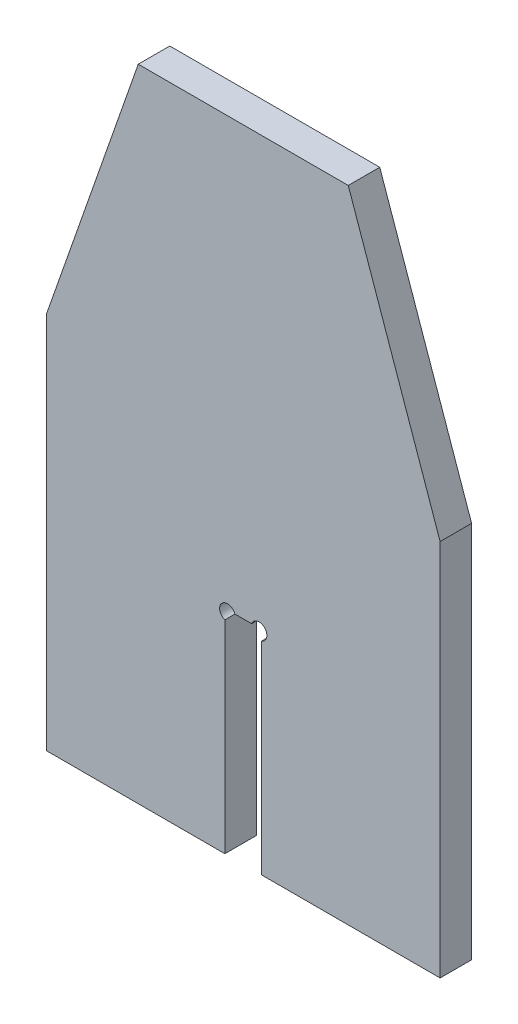
ISO-10303-21;
HEADER;
FILE_DESCRIPTION(('STEP AP214'),'2;1');
FILE_NAME('part.step','',(''),(''),'','','');
FILE_SCHEMA(('AUTOMOTIVE_DESIGN { 1 0 10303 214 1 1 1 1 }'));
ENDSEC;
DATA;
#1=APPLICATION_CONTEXT('core data for automotive mechanical design processes');
#2=APPLICATION_PROTOCOL_DEFINITION('international standard','automotive_design',2000,#1);
#3=PRODUCT_CONTEXT('',#1,'mechanical');
#4=PRODUCT('Part','Part','',(#3));
#5=PRODUCT_RELATED_PRODUCT_CATEGORY('part','',(#4));
#6=PRODUCT_DEFINITION_FORMATION('','',#4);
#7=PRODUCT_DEFINITION_CONTEXT('part definition',#1,'design');
#8=PRODUCT_DEFINITION('design','',#6,#7);
#9=PRODUCT_DEFINITION_SHAPE('','',#8);
#10=(LENGTH_UNIT() NAMED_UNIT(*) SI_UNIT(.MILLI.,.METRE.));
#11=(NAMED_UNIT(*) PLANE_ANGLE_UNIT() SI_UNIT($,.RADIAN.));
#12=(NAMED_UNIT(*) SI_UNIT($,.STERADIAN.) SOLID_ANGLE_UNIT());
#13=UNCERTAINTY_MEASURE_WITH_UNIT(LENGTH_MEASURE(1.E-05),#10,'distance_accuracy_value','');
#14=(GEOMETRIC_REPRESENTATION_CONTEXT(3) GLOBAL_UNCERTAINTY_ASSIGNED_CONTEXT((#13)) GLOBAL_UNIT_ASSIGNED_CONTEXT((#10,
#11,#12)) REPRESENTATION_CONTEXT('',''));
#15=CARTESIAN_POINT('',(0.,0.,0.));
#16=DIRECTION('',(0.,0.,1.));
#17=DIRECTION('',(1.,0.,0.));
#18=AXIS2_PLACEMENT_3D('',#15,#16,#17);
#19=CARTESIAN_POINT('',(0.,0.,0.));
#20=DIRECTION('',(0.,0.,1.));
#21=DIRECTION('',(0.,-1.,0.));
#22=AXIS2_PLACEMENT_3D('',#19,#20,#21);
#23=PLANE('',#22);
#24=DIRECTION('',(1.,0.,0.));
#25=VECTOR('',#24,1.);
#26=CARTESIAN_POINT('',(-1.09287578986539E-13,252.000025877441,0.));
#27=LINE('',#26,#25);
#28=CARTESIAN_POINT('',(-17.5,252.000025877441,0.));
#29=VERTEX_POINT('',#28);
#30=CARTESIAN_POINT('',(14.1253730857898,252.000025877441,0.));
#31=VERTEX_POINT('',#30);
#32=EDGE_CURVE('E51',#29,#31,#27,.T.);
#33=ORIENTED_EDGE('',*,*,#32,.T.);
#34=DIRECTION('',(0.759824818478074,-0.650127868364956,0.));
#35=VECTOR('',#34,1.);
#36=CARTESIAN_POINT('',(130.454120158714,152.465819406573,0.));
#37=LINE('',#36,#35);
#38=CARTESIAN_POINT('',(37.4999999999995,232.000025877441,0.));
#39=VERTEX_POINT('',#38);
#40=EDGE_CURVE('E185',#31,#39,#37,.T.);
#41=ORIENTED_EDGE('',*,*,#40,.T.);
#42=DIRECTION('',(0.,-1.,0.));
#43=VECTOR('',#42,1.);
#44=CARTESIAN_POINT('',(37.4999999999996,0.,0.));
#45=LINE('',#44,#43);
#46=CARTESIAN_POINT('',(37.4999999999994,160.,0.));
#47=VERTEX_POINT('',#46);
#48=EDGE_CURVE('E255',#39,#47,#45,.T.);
#49=ORIENTED_EDGE('',*,*,#48,.T.);
#50=DIRECTION('',(-1.,0.,0.));
#51=VECTOR('',#50,1.);
#52=CARTESIAN_POINT('',(0.,160.,0.));
#53=LINE('',#52,#51);
#54=CARTESIAN_POINT('',(3.50000000001344,160.,0.));
#55=VERTEX_POINT('',#54);
#56=EDGE_CURVE('E244',#47,#55,#53,.T.);
#57=ORIENTED_EDGE('',*,*,#56,.T.);
#58=DIRECTION('',(0.,1.,0.));
#59=VECTOR('',#58,1.);
#60=CARTESIAN_POINT('',(3.50000000001346,0.,0.));
#61=LINE('',#60,#59);
#62=CARTESIAN_POINT('',(3.50000000001344,198.585786437627,0.));
#63=VERTEX_POINT('',#62);
#64=EDGE_CURVE('E216',#55,#63,#61,.T.);
#65=ORIENTED_EDGE('',*,*,#64,.T.);
#66=CARTESIAN_POINT('',(3.00000000001337,200.,0.));
#67=DIRECTION('',(0.,0.,-1.));
#68=DIRECTION('',(0.,1.,0.));
#69=AXIS2_PLACEMENT_3D('',#66,#67,#68);
#70=CIRCLE('',#69,1.49999999999998);
#71=CARTESIAN_POINT('',(1.5857864376403,200.5,0.));
#72=VERTEX_POINT('',#71);
#73=EDGE_CURVE('E243',#63,#72,#70,.F.);
#74=ORIENTED_EDGE('',*,*,#73,.T.);
#75=DIRECTION('',(-1.,0.,0.));
#76=VECTOR('',#75,1.);
#77=CARTESIAN_POINT('',(0.,200.5,0.));
#78=LINE('',#77,#76);
#79=CARTESIAN_POINT('',(-1.58578643761337,200.5,0.));
#80=VERTEX_POINT('',#79);
#81=EDGE_CURVE('E220',#72,#80,#78,.T.);
#82=ORIENTED_EDGE('',*,*,#81,.T.);
#83=CARTESIAN_POINT('',(-2.99999999998644,200.,0.));
#84=DIRECTION('',(0.,0.,-1.));
#85=DIRECTION('',(0.,1.,0.));
#86=AXIS2_PLACEMENT_3D('',#83,#84,#85);
#87=CIRCLE('',#86,1.49999999999998);
#88=CARTESIAN_POINT('',(-3.49999999998656,198.585786437627,0.));
#89=VERTEX_POINT('',#88);
#90=EDGE_CURVE('E232',#80,#89,#87,.F.);
#91=ORIENTED_EDGE('',*,*,#90,.T.);
#92=DIRECTION('',(0.,-1.,0.));
#93=VECTOR('',#92,1.);
#94=CARTESIAN_POINT('',(-3.49999999998656,0.,0.));
#95=LINE('',#94,#93);
#96=CARTESIAN_POINT('',(-3.49999999998656,160.,0.));
#97=VERTEX_POINT('',#96);
#98=EDGE_CURVE('E229',#89,#97,#95,.T.);
#99=ORIENTED_EDGE('',*,*,#98,.T.);
#100=DIRECTION('',(-1.,0.,0.));
#101=VECTOR('',#100,1.);
#102=CARTESIAN_POINT('',(-2.48065457064683E-13,160.,0.));
#103=LINE('',#102,#101);
#104=CARTESIAN_POINT('',(-37.4999999999997,160.,0.));
#105=VERTEX_POINT('',#104);
#106=EDGE_CURVE('E282',#97,#105,#103,.T.);
#107=ORIENTED_EDGE('',*,*,#106,.T.);
#108=DIRECTION('',(0.,-1.,0.));
#109=VECTOR('',#108,1.);
#110=CARTESIAN_POINT('',(-37.4999999999997,0.,0.));
#111=LINE('',#110,#109);
#112=CARTESIAN_POINT('',(-37.4999999999998,232.000025877442,0.));
#113=VERTEX_POINT('',#112);
#114=EDGE_CURVE('E270',#113,#105,#111,.T.);
#115=ORIENTED_EDGE('',*,*,#114,.F.);
#116=DIRECTION('',(0.707106781186542,0.707106781186553,0.));
#117=VECTOR('',#116,1.);
#118=CARTESIAN_POINT('',(-134.750012938719,134.750012938721,0.));
#119=LINE('',#118,#117);
#120=EDGE_CURVE('E149',#113,#29,#119,.T.);
#121=ORIENTED_EDGE('',*,*,#120,.T.);
#122=EDGE_LOOP('',(#33,#41,#49,#57,#65,#74,#82,#91,#99,#107,#115,#121));
#123=FACE_BOUND('',#122,.T.);
#124=CARTESIAN_POINT('',(9.64995892933224E-05,239.99993796999,0.));
#125=DIRECTION('',(0.,0.,1.));
#126=DIRECTION('',(0.,-1.,0.));
#127=AXIS2_PLACEMENT_3D('',#124,#125,#126);
#128=CIRCLE('',#127,8.9999999999999);
#129=CARTESIAN_POINT('',(9.64995892933224E-05,230.99993796999,0.));
#130=VERTEX_POINT('',#129);
#131=EDGE_CURVE('E203',#130,#130,#128,.T.);
#132=ORIENTED_EDGE('',*,*,#131,.T.);
#133=EDGE_LOOP('',(#132));
#134=FACE_BOUND('',#133,.T.);
#135=ADVANCED_FACE('F35',(#123,#134),#23,.F.);
#136=CARTESIAN_POINT('',(-2.99999999998644,200.,124.697113534619));
#137=DIRECTION('',(0.,0.,-1.));
#138=DIRECTION('',(0.,1.,0.));
#139=AXIS2_PLACEMENT_3D('',#136,#137,#138);
#140=CYLINDRICAL_SURFACE('',#139,1.49999999999998);
#141=CARTESIAN_POINT('',(-2.99999999998644,200.,5.99999999999995));
#142=DIRECTION('',(0.,0.,-1.));
#143=DIRECTION('',(0.,1.,0.));
#144=AXIS2_PLACEMENT_3D('',#141,#142,#143);
#145=CIRCLE('',#144,1.49999999999998);
#146=CARTESIAN_POINT('',(-1.58578643761337,200.5,5.99999999999837));
#147=VERTEX_POINT('',#146);
#148=CARTESIAN_POINT('',(-3.49999999998651,198.585786437627,5.99999999999995));
#149=VERTEX_POINT('',#148);
#150=EDGE_CURVE('E279',#147,#149,#145,.F.);
#151=ORIENTED_EDGE('',*,*,#150,.T.);
#152=DIRECTION('',(0.,0.,-1.));
#153=VECTOR('',#152,1.);
#154=CARTESIAN_POINT('',(-3.49999999998656,198.585786437627,124.697113534619));
#155=LINE('',#154,#153);
#156=EDGE_CURVE('E226',#149,#89,#155,.T.);
#157=ORIENTED_EDGE('',*,*,#156,.T.);
#158=ORIENTED_EDGE('',*,*,#90,.F.);
#159=DIRECTION('',(0.,0.,-1.));
#160=VECTOR('',#159,1.);
#161=CARTESIAN_POINT('',(-1.58578643761337,200.5,124.697113534619));
#162=LINE('',#161,#160);
#163=EDGE_CURVE('E223',#80,#147,#162,.F.);
#164=ORIENTED_EDGE('',*,*,#163,.T.);
#165=EDGE_LOOP('',(#151,#157,#158,#164));
#166=FACE_BOUND('',#165,.T.);
#167=ADVANCED_FACE('F312',(#166),#140,.F.);
#168=CARTESIAN_POINT('',(-2.48065457064683E-13,160.,124.697113534619));
#169=DIRECTION('',(0.,1.,0.));
#170=DIRECTION('',(-1.,0.,0.));
#171=AXIS2_PLACEMENT_3D('',#168,#169,#170);
#172=PLANE('',#171);
#173=ORIENTED_EDGE('',*,*,#106,.F.);
#174=DIRECTION('',(0.,0.,1.));
#175=VECTOR('',#174,1.);
#176=CARTESIAN_POINT('',(-3.49999999998656,160.,-0.000103077642273249));
#177=LINE('',#176,#175);
#178=CARTESIAN_POINT('',(-3.49999999998656,160.,5.99999999999837));
#179=VERTEX_POINT('',#178);
#180=EDGE_CURVE('E208',#97,#179,#177,.T.);
#181=ORIENTED_EDGE('',*,*,#180,.T.);
#182=DIRECTION('',(-1.,0.,0.));
#183=VECTOR('',#182,1.);
#184=CARTESIAN_POINT('',(-855.599205235686,160.,5.99999999999825));
#185=LINE('',#184,#183);
#186=CARTESIAN_POINT('',(-37.4999999999995,160.,5.99999999999838));
#187=VERTEX_POINT('',#186);
#188=EDGE_CURVE('E264',#179,#187,#185,.T.);
#189=ORIENTED_EDGE('',*,*,#188,.T.);
#190=DIRECTION('',(0.,0.,1.));
#191=VECTOR('',#190,1.);
#192=CARTESIAN_POINT('',(-37.4999999999997,160.,124.697113534619));
#193=LINE('',#192,#191);
#194=EDGE_CURVE('E267',#105,#187,#193,.T.);
#195=ORIENTED_EDGE('',*,*,#194,.F.);
#196=EDGE_LOOP('',(#173,#181,#189,#195));
#197=FACE_BOUND('',#196,.T.);
#198=ADVANCED_FACE('F318',(#197),#172,.F.);
#199=CARTESIAN_POINT('',(-37.4999999999997,0.,124.697113534619));
#200=DIRECTION('',(-1.,0.,0.));
#201=DIRECTION('',(0.,-1.,0.));
#202=AXIS2_PLACEMENT_3D('',#199,#200,#201);
#203=PLANE('',#202);
#204=ORIENTED_EDGE('',*,*,#114,.T.);
#205=ORIENTED_EDGE('',*,*,#194,.T.);
#206=DIRECTION('',(0.,1.,0.));
#207=VECTOR('',#206,1.);
#208=CARTESIAN_POINT('',(-37.4999999999994,-1.11022302462516E-13,5.99999999999836));
#209=LINE('',#208,#207);
#210=CARTESIAN_POINT('',(-37.4999999999995,232.000025877441,5.99999999999838));
#211=VERTEX_POINT('',#210);
#212=EDGE_CURVE('E249',#187,#211,#209,.T.);
#213=ORIENTED_EDGE('',*,*,#212,.T.);
#214=DIRECTION('',(0.,0.,1.));
#215=VECTOR('',#214,1.);
#216=CARTESIAN_POINT('',(-37.4999999999998,232.000025877442,124.697113534619));
#217=LINE('',#216,#215);
#218=EDGE_CURVE('E258',#211,#113,#217,.F.);
#219=ORIENTED_EDGE('',*,*,#218,.T.);
#220=EDGE_LOOP('',(#204,#205,#213,#219));
#221=FACE_BOUND('',#220,.T.);
#222=ADVANCED_FACE('F322',(#221),#203,.T.);
#223=CARTESIAN_POINT('',(37.4999999999996,0.,124.697113534619));
#224=DIRECTION('',(-1.,0.,0.));
#225=DIRECTION('',(0.,-1.,0.));
#226=AXIS2_PLACEMENT_3D('',#223,#224,#225);
#227=PLANE('',#226);
#228=DIRECTION('',(0.,1.,0.));
#229=VECTOR('',#228,1.);
#230=CARTESIAN_POINT('',(37.4999999999995,-1.11022302462516E-13,5.99999999999838));
#231=LINE('',#230,#229);
#232=CARTESIAN_POINT('',(37.4999999999996,232.000025877441,5.99999999999841));
#233=VERTEX_POINT('',#232);
#234=CARTESIAN_POINT('',(37.4999999999995,160.,5.9999999999984));
#235=VERTEX_POINT('',#234);
#236=EDGE_CURVE('E237',#233,#235,#231,.F.);
#237=ORIENTED_EDGE('',*,*,#236,.T.);
#238=DIRECTION('',(0.,0.,1.));
#239=VECTOR('',#238,1.);
#240=CARTESIAN_POINT('',(37.4999999999993,160.,124.697113534619));
#241=LINE('',#240,#239);
#242=EDGE_CURVE('E240',#235,#47,#241,.F.);
#243=ORIENTED_EDGE('',*,*,#242,.T.);
#244=ORIENTED_EDGE('',*,*,#48,.F.);
#245=DIRECTION('',(0.,0.,1.));
#246=VECTOR('',#245,1.);
#247=CARTESIAN_POINT('',(37.4999999999996,232.000025877441,124.697113534619));
#248=LINE('',#247,#246);
#249=EDGE_CURVE('E252',#233,#39,#248,.F.);
#250=ORIENTED_EDGE('',*,*,#249,.F.);
#251=EDGE_LOOP('',(#237,#243,#244,#250));
#252=FACE_BOUND('',#251,.T.);
#253=ADVANCED_FACE('F350',(#252),#227,.F.);
#254=CARTESIAN_POINT('',(0.,160.,124.697113534619));
#255=DIRECTION('',(0.,1.,0.));
#256=DIRECTION('',(-1.,0.,0.));
#257=AXIS2_PLACEMENT_3D('',#254,#255,#256);
#258=PLANE('',#257);
#259=DIRECTION('',(-1.,0.,0.));
#260=VECTOR('',#259,1.);
#261=CARTESIAN_POINT('',(-855.599205235686,160.,5.99999999999825));
#262=LINE('',#261,#260);
#263=CARTESIAN_POINT('',(3.50000000001338,160.,5.99999999999839));
#264=VERTEX_POINT('',#263);
#265=EDGE_CURVE('E233',#235,#264,#262,.T.);
#266=ORIENTED_EDGE('',*,*,#265,.T.);
#267=DIRECTION('',(0.,0.,1.));
#268=VECTOR('',#267,1.);
#269=CARTESIAN_POINT('',(3.50000000001344,160.,-0.000103077642273249));
#270=LINE('',#269,#268);
#271=EDGE_CURVE('E209',#55,#264,#270,.T.);
#272=ORIENTED_EDGE('',*,*,#271,.F.);
#273=ORIENTED_EDGE('',*,*,#56,.F.);
#274=ORIENTED_EDGE('',*,*,#242,.F.);
#275=EDGE_LOOP('',(#266,#272,#273,#274));
#276=FACE_BOUND('',#275,.T.);
#277=ADVANCED_FACE('F352',(#276),#258,.F.);
#278=CARTESIAN_POINT('',(3.00000000001337,200.,124.697113534619));
#279=DIRECTION('',(0.,0.,-1.));
#280=DIRECTION('',(0.,1.,0.));
#281=AXIS2_PLACEMENT_3D('',#278,#279,#280);
#282=CYLINDRICAL_SURFACE('',#281,1.49999999999998);
#283=CARTESIAN_POINT('',(3.00000000001337,200.,5.99999999999988));
#284=DIRECTION('',(0.,0.,-1.));
#285=DIRECTION('',(0.,1.,0.));
#286=AXIS2_PLACEMENT_3D('',#283,#284,#285);
#287=CIRCLE('',#286,1.49999999999998);
#288=CARTESIAN_POINT('',(3.50000000001344,198.585786437627,5.99999999999837));
#289=VERTEX_POINT('',#288);
#290=CARTESIAN_POINT('',(1.5857864376403,200.5,5.99999999999988));
#291=VERTEX_POINT('',#290);
#292=EDGE_CURVE('E236',#289,#291,#287,.F.);
#293=ORIENTED_EDGE('',*,*,#292,.T.);
#294=DIRECTION('',(0.,0.,-1.));
#295=VECTOR('',#294,1.);
#296=CARTESIAN_POINT('',(1.5857864376403,200.5,124.697113534619));
#297=LINE('',#296,#295);
#298=EDGE_CURVE('E59',#291,#72,#297,.T.);
#299=ORIENTED_EDGE('',*,*,#298,.T.);
#300=ORIENTED_EDGE('',*,*,#73,.F.);
#301=DIRECTION('',(0.,0.,-1.));
#302=VECTOR('',#301,1.);
#303=CARTESIAN_POINT('',(3.50000000001344,198.585786437627,124.697113534619));
#304=LINE('',#303,#302);
#305=EDGE_CURVE('E211',#63,#289,#304,.F.);
#306=ORIENTED_EDGE('',*,*,#305,.T.);
#307=EDGE_LOOP('',(#293,#299,#300,#306));
#308=FACE_BOUND('',#307,.T.);
#309=ADVANCED_FACE('F302',(#308),#282,.F.);
#310=CARTESIAN_POINT('',(-855.599205235686,-1.11022302462516E-13,5.99999999999823));
#311=DIRECTION('',(0.,0.,-1.));
#312=DIRECTION('',(-1.,0.,0.));
#313=AXIS2_PLACEMENT_3D('',#310,#311,#312);
#314=PLANE('',#313);
#315=ORIENTED_EDGE('',*,*,#236,.F.);
#316=DIRECTION('',(-0.330348801885767,0.94385892435927,0.));
#317=VECTOR('',#316,1.);
#318=CARTESIAN_POINT('',(37.4999999999996,232.000025877441,5.99999999999837));
#319=LINE('',#318,#317);
#320=CARTESIAN_POINT('',(20.0000964995893,282.000025877441,5.99999999999837));
#321=VERTEX_POINT('',#320);
#322=EDGE_CURVE('E173',#233,#321,#319,.T.);
#323=ORIENTED_EDGE('',*,*,#322,.T.);
#324=DIRECTION('',(-1.,0.,0.));
#325=VECTOR('',#324,1.);
#326=CARTESIAN_POINT('',(-19.9999035004107,282.000025877441,5.99999999999837));
#327=LINE('',#326,#325);
#328=CARTESIAN_POINT('',(-19.9999035004107,282.000025877441,5.99999999999837));
#329=VERTEX_POINT('',#328);
#330=EDGE_CURVE('E170',#321,#329,#327,.T.);
#331=ORIENTED_EDGE('',*,*,#330,.T.);
#332=DIRECTION('',(-0.330352047567502,-0.943857788370663,0.));
#333=VECTOR('',#332,1.);
#334=CARTESIAN_POINT('',(-37.4999999999995,232.000025877441,5.99999999999837));
#335=LINE('',#334,#333);
#336=EDGE_CURVE('E285',#329,#211,#335,.T.);
#337=ORIENTED_EDGE('',*,*,#336,.T.);
#338=ORIENTED_EDGE('',*,*,#212,.F.);
#339=ORIENTED_EDGE('',*,*,#188,.F.);
#340=DIRECTION('',(0.,1.,0.));
#341=VECTOR('',#340,1.);
#342=CARTESIAN_POINT('',(-3.49999999998651,-1.11022302462516E-13,5.99999999999837));
#343=LINE('',#342,#341);
#344=EDGE_CURVE('E11',#179,#149,#343,.T.);
#345=ORIENTED_EDGE('',*,*,#344,.T.);
#346=ORIENTED_EDGE('',*,*,#150,.F.);
#347=DIRECTION('',(1.,0.,0.));
#348=VECTOR('',#347,1.);
#349=CARTESIAN_POINT('',(-855.599205235686,200.5,5.99999999999825));
#350=LINE('',#349,#348);
#351=EDGE_CURVE('E43',#147,#291,#350,.T.);
#352=ORIENTED_EDGE('',*,*,#351,.T.);
#353=ORIENTED_EDGE('',*,*,#292,.F.);
#354=DIRECTION('',(0.,1.,0.));
#355=VECTOR('',#354,1.);
#356=CARTESIAN_POINT('',(3.50000000001344,160.,5.99999999999837));
#357=LINE('',#356,#355);
#358=EDGE_CURVE('E206',#264,#289,#357,.T.);
#359=ORIENTED_EDGE('',*,*,#358,.F.);
#360=ORIENTED_EDGE('',*,*,#265,.F.);
#361=EDGE_LOOP('',(#315,#323,#331,#337,#338,#339,#345,#346,#352,#353,#359,#360));
#362=FACE_BOUND('',#361,.T.);
#363=ADVANCED_FACE('F307',(#362),#314,.F.);
#364=CARTESIAN_POINT('',(3.50000000001344,160.,-0.000103077642273249));
#365=DIRECTION('',(1.,0.,0.));
#366=DIRECTION('',(0.,1.,0.));
#367=AXIS2_PLACEMENT_3D('',#364,#365,#366);
#368=PLANE('',#367);
#369=ORIENTED_EDGE('',*,*,#271,.T.);
#370=ORIENTED_EDGE('',*,*,#358,.T.);
#371=ORIENTED_EDGE('',*,*,#305,.F.);
#372=ORIENTED_EDGE('',*,*,#64,.F.);
#373=EDGE_LOOP('',(#369,#370,#371,#372));
#374=FACE_BOUND('',#373,.T.);
#375=ADVANCED_FACE('F355',(#374),#368,.F.);
#376=CARTESIAN_POINT('',(-3.49999999998656,200.5,-0.000103077642273249));
#377=DIRECTION('',(0.,1.,0.));
#378=DIRECTION('',(0.,0.,1.));
#379=AXIS2_PLACEMENT_3D('',#376,#377,#378);
#380=PLANE('',#379);
#381=ORIENTED_EDGE('',*,*,#81,.F.);
#382=ORIENTED_EDGE('',*,*,#298,.F.);
#383=ORIENTED_EDGE('',*,*,#351,.F.);
#384=ORIENTED_EDGE('',*,*,#163,.F.);
#385=EDGE_LOOP('',(#381,#382,#383,#384));
#386=FACE_BOUND('',#385,.T.);
#387=ADVANCED_FACE('F310',(#386),#380,.F.);
#388=CARTESIAN_POINT('',(-3.49999999998656,160.,-0.000103077642273249));
#389=DIRECTION('',(-1.,0.,0.));
#390=DIRECTION('',(0.,0.,1.));
#391=AXIS2_PLACEMENT_3D('',#388,#389,#390);
#392=PLANE('',#391);
#393=ORIENTED_EDGE('',*,*,#156,.F.);
#394=ORIENTED_EDGE('',*,*,#344,.F.);
#395=ORIENTED_EDGE('',*,*,#180,.F.);
#396=ORIENTED_EDGE('',*,*,#98,.F.);
#397=EDGE_LOOP('',(#393,#394,#395,#396));
#398=FACE_BOUND('',#397,.T.);
#399=ADVANCED_FACE('F362',(#398),#392,.F.);
#400=CARTESIAN_POINT('',(9.64995892933224E-05,239.99993796999,-0.000103077642273249));
#401=DIRECTION('',(0.,0.,1.));
#402=DIRECTION('',(1.,0.,0.));
#403=AXIS2_PLACEMENT_3D('',#400,#401,#402);
#404=CYLINDRICAL_SURFACE('',#403,8.9999999999999);
#405=CARTESIAN_POINT('',(9.64995892933224E-05,239.99993796999,-0.000103077642273249));
#406=DIRECTION('',(0.,0.,1.));
#407=DIRECTION('',(1.,0.,0.));
#408=AXIS2_PLACEMENT_3D('',#405,#406,#407);
#409=CIRCLE('',#408,8.9999999999999);
#410=CARTESIAN_POINT('',(9.00009649958919,239.99993796999,-0.000103077642273249));
#411=VERTEX_POINT('',#410);
#412=EDGE_CURVE('E198',#411,#411,#409,.T.);
#413=ORIENTED_EDGE('',*,*,#412,.T.);
#414=EDGE_LOOP('',(#413));
#415=FACE_BOUND('',#414,.T.);
#416=ORIENTED_EDGE('',*,*,#131,.F.);
#417=EDGE_LOOP('',(#416));
#418=FACE_BOUND('',#417,.T.);
#419=ADVANCED_FACE('F384',(#415,#418),#404,.T.);
#420=CARTESIAN_POINT('',(9.64995892933224E-05,239.99993796999,-0.000103077642273249));
#421=DIRECTION('',(0.,0.,1.));
#422=DIRECTION('',(1.,0.,0.));
#423=AXIS2_PLACEMENT_3D('',#420,#421,#422);
#424=PLANE('',#423);
#425=ORIENTED_EDGE('',*,*,#412,.F.);
#426=EDGE_LOOP('',(#425));
#427=FACE_BOUND('',#426,.T.);
#428=ADVANCED_FACE('F387',(#427),#424,.F.);
#429=CARTESIAN_POINT('',(37.4999999999996,232.000025877441,-0.000103077642273249));
#430=DIRECTION('',(-0.650127868364956,-0.759824818478074,0.));
#431=DIRECTION('',(0.759824818478074,-0.650127868364956,0.));
#432=AXIS2_PLACEMENT_3D('',#429,#430,#431);
#433=PLANE('',#432);
#434=ORIENTED_EDGE('',*,*,#40,.F.);
#435=DIRECTION('',(0.,0.,1.));
#436=VECTOR('',#435,1.);
#437=CARTESIAN_POINT('',(14.1253730857898,252.000025877441,-0.000103077642273249));
#438=LINE('',#437,#436);
#439=CARTESIAN_POINT('',(14.1253730857898,252.000025877441,-0.000103077642273249));
#440=VERTEX_POINT('',#439);
#441=EDGE_CURVE('E191',#440,#31,#438,.T.);
#442=ORIENTED_EDGE('',*,*,#441,.F.);
#443=DIRECTION('',(0.759824818478074,-0.650127868364956,0.));
#444=VECTOR('',#443,1.);
#445=CARTESIAN_POINT('',(37.4999999999996,232.000025877441,-0.000103077642273249));
#446=LINE('',#445,#444);
#447=CARTESIAN_POINT('',(37.4999999999996,232.000025877441,-0.000103077642273249));
#448=VERTEX_POINT('',#447);
#449=EDGE_CURVE('E177',#440,#448,#446,.T.);
#450=ORIENTED_EDGE('',*,*,#449,.T.);
#451=DIRECTION('',(0.,0.,1.));
#452=VECTOR('',#451,1.);
#453=CARTESIAN_POINT('',(37.4999999999996,232.000025877441,-0.000103077642273249));
#454=LINE('',#453,#452);
#455=EDGE_CURVE('E188',#448,#39,#454,.T.);
#456=ORIENTED_EDGE('',*,*,#455,.T.);
#457=EDGE_LOOP('',(#434,#442,#450,#456));
#458=FACE_BOUND('',#457,.T.);
#459=ADVANCED_FACE('F333',(#458),#433,.T.);
#460=CARTESIAN_POINT('',(-17.4999999999999,252.000025877441,-0.000103077642273249));
#461=DIRECTION('',(0.,-1.,0.));
#462=DIRECTION('',(0.,0.,-1.));
#463=AXIS2_PLACEMENT_3D('',#460,#461,#462);
#464=PLANE('',#463);
#465=ORIENTED_EDGE('',*,*,#32,.F.);
#466=DIRECTION('',(0.,0.,1.));
#467=VECTOR('',#466,1.);
#468=CARTESIAN_POINT('',(-17.4999999999999,252.000025877441,-0.000103077642273249));
#469=LINE('',#468,#467);
#470=CARTESIAN_POINT('',(-17.4999999999999,252.000025877441,-0.000103077642273249));
#471=VERTEX_POINT('',#470);
#472=EDGE_CURVE('E153',#471,#29,#469,.T.);
#473=ORIENTED_EDGE('',*,*,#472,.F.);
#474=DIRECTION('',(1.,0.,0.));
#475=VECTOR('',#474,1.);
#476=CARTESIAN_POINT('',(-17.4999999999999,252.000025877441,-0.000103077642273249));
#477=LINE('',#476,#475);
#478=EDGE_CURVE('E165',#471,#440,#477,.T.);
#479=ORIENTED_EDGE('',*,*,#478,.T.);
#480=ORIENTED_EDGE('',*,*,#441,.T.);
#481=EDGE_LOOP('',(#465,#473,#479,#480));
#482=FACE_BOUND('',#481,.T.);
#483=ADVANCED_FACE('F336',(#482),#464,.T.);
#484=CARTESIAN_POINT('',(-37.4999999999995,232.000025877441,-0.000103077642273249));
#485=DIRECTION('',(0.707106781186552,-0.707106781186543,0.));
#486=DIRECTION('',(0.707106781186543,0.707106781186552,0.));
#487=AXIS2_PLACEMENT_3D('',#484,#485,#486);
#488=PLANE('',#487);
#489=ORIENTED_EDGE('',*,*,#120,.F.);
#490=DIRECTION('',(0.,0.,1.));
#491=VECTOR('',#490,1.);
#492=CARTESIAN_POINT('',(-37.4999999999995,232.000025877441,-0.000103077642273249));
#493=LINE('',#492,#491);
#494=CARTESIAN_POINT('',(-37.4999999999995,232.000025877441,-0.000103077642273249));
#495=VERTEX_POINT('',#494);
#496=EDGE_CURVE('E144',#495,#113,#493,.T.);
#497=ORIENTED_EDGE('',*,*,#496,.F.);
#498=DIRECTION('',(0.707106781186543,0.707106781186552,0.));
#499=VECTOR('',#498,1.);
#500=CARTESIAN_POINT('',(-37.4999999999995,232.000025877441,-0.000103077642273249));
#501=LINE('',#500,#499);
#502=EDGE_CURVE('E148',#495,#471,#501,.T.);
#503=ORIENTED_EDGE('',*,*,#502,.T.);
#504=ORIENTED_EDGE('',*,*,#472,.T.);
#505=EDGE_LOOP('',(#489,#497,#503,#504));
#506=FACE_BOUND('',#505,.T.);
#507=ADVANCED_FACE('F146',(#506),#488,.T.);
#508=CARTESIAN_POINT('',(-37.4999999999995,232.000025877441,-0.000103077642273249));
#509=DIRECTION('',(-0.943857788370663,0.330352047567502,0.));
#510=DIRECTION('',(-0.330352047567502,-0.943857788370663,0.));
#511=AXIS2_PLACEMENT_3D('',#508,#509,#510);
#512=PLANE('',#511);
#513=ORIENTED_EDGE('',*,*,#336,.F.);
#514=DIRECTION('',(0.,0.,1.));
#515=VECTOR('',#514,1.);
#516=CARTESIAN_POINT('',(-19.9999035004107,282.000025877441,-0.000103077642273249));
#517=LINE('',#516,#515);
#518=CARTESIAN_POINT('',(-19.9999035004107,282.000025877441,-0.000103077642273249));
#519=VERTEX_POINT('',#518);
#520=EDGE_CURVE('E169',#519,#329,#517,.T.);
#521=ORIENTED_EDGE('',*,*,#520,.F.);
#522=DIRECTION('',(-0.330352047567502,-0.943857788370663,0.));
#523=VECTOR('',#522,1.);
#524=CARTESIAN_POINT('',(-37.4999999999995,232.000025877441,-0.000103077642273249));
#525=LINE('',#524,#523);
#526=EDGE_CURVE('E161',#519,#495,#525,.T.);
#527=ORIENTED_EDGE('',*,*,#526,.T.);
#528=ORIENTED_EDGE('',*,*,#496,.T.);
#529=ORIENTED_EDGE('',*,*,#218,.F.);
#530=EDGE_LOOP('',(#513,#521,#527,#528,#529));
#531=FACE_BOUND('',#530,.T.);
#532=ADVANCED_FACE('F168',(#531),#512,.T.);
#533=CARTESIAN_POINT('',(-19.9999035004107,282.000025877441,-0.000103077642273249));
#534=DIRECTION('',(0.,1.,0.));
#535=DIRECTION('',(0.,0.,1.));
#536=AXIS2_PLACEMENT_3D('',#533,#534,#535);
#537=PLANE('',#536);
#538=ORIENTED_EDGE('',*,*,#330,.F.);
#539=DIRECTION('',(0.,0.,1.));
#540=VECTOR('',#539,1.);
#541=CARTESIAN_POINT('',(20.0000964995893,282.000025877441,-0.000103077642273249));
#542=LINE('',#541,#540);
#543=CARTESIAN_POINT('',(20.0000964995893,282.000025877441,-0.000103077642273249));
#544=VERTEX_POINT('',#543);
#545=EDGE_CURVE('E186',#544,#321,#542,.T.);
#546=ORIENTED_EDGE('',*,*,#545,.F.);
#547=DIRECTION('',(-1.,0.,0.));
#548=VECTOR('',#547,1.);
#549=CARTESIAN_POINT('',(-19.9999035004107,282.000025877441,-0.000103077642273249));
#550=LINE('',#549,#548);
#551=EDGE_CURVE('E154',#544,#519,#550,.T.);
#552=ORIENTED_EDGE('',*,*,#551,.T.);
#553=ORIENTED_EDGE('',*,*,#520,.T.);
#554=EDGE_LOOP('',(#538,#546,#552,#553));
#555=FACE_BOUND('',#554,.T.);
#556=ADVANCED_FACE('F330',(#555),#537,.T.);
#557=CARTESIAN_POINT('',(37.4999999999996,232.000025877441,-0.000103077642273249));
#558=DIRECTION('',(0.94385892435927,0.330348801885767,0.));
#559=DIRECTION('',(-0.330348801885767,0.94385892435927,0.));
#560=AXIS2_PLACEMENT_3D('',#557,#558,#559);
#561=PLANE('',#560);
#562=ORIENTED_EDGE('',*,*,#322,.F.);
#563=ORIENTED_EDGE('',*,*,#249,.T.);
#564=ORIENTED_EDGE('',*,*,#455,.F.);
#565=DIRECTION('',(-0.330348801885767,0.94385892435927,0.));
#566=VECTOR('',#565,1.);
#567=CARTESIAN_POINT('',(37.4999999999996,232.000025877441,-0.000103077642273249));
#568=LINE('',#567,#566);
#569=EDGE_CURVE('E180',#448,#544,#568,.T.);
#570=ORIENTED_EDGE('',*,*,#569,.T.);
#571=ORIENTED_EDGE('',*,*,#545,.T.);
#572=EDGE_LOOP('',(#562,#563,#564,#570,#571));
#573=FACE_BOUND('',#572,.T.);
#574=ADVANCED_FACE('F405',(#573),#561,.T.);
#575=CARTESIAN_POINT('',(0.,0.,-0.000103077642273249));
#576=DIRECTION('',(0.,0.,-1.));
#577=DIRECTION('',(-1.,0.,0.));
#578=AXIS2_PLACEMENT_3D('',#575,#576,#577);
#579=PLANE('',#578);
#580=ORIENTED_EDGE('',*,*,#526,.F.);
#581=ORIENTED_EDGE('',*,*,#551,.F.);
#582=ORIENTED_EDGE('',*,*,#569,.F.);
#583=ORIENTED_EDGE('',*,*,#449,.F.);
#584=ORIENTED_EDGE('',*,*,#478,.F.);
#585=ORIENTED_EDGE('',*,*,#502,.F.);
#586=EDGE_LOOP('',(#580,#581,#582,#583,#584,#585));
#587=FACE_BOUND('',#586,.T.);
#588=ADVANCED_FACE('F159',(#587),#579,.T.);
#589=CLOSED_SHELL('',(#135,#167,#198,#222,#253,#277,#309,#363,#375,#387,#399,#419,#428,#459,
#483,#507,#532,#556,#574,#588));
#590=MANIFOLD_SOLID_BREP('B2',#589);
#591=ADVANCED_BREP_SHAPE_REPRESENTATION('',(#18,#590),#14);
#592=SHAPE_DEFINITION_REPRESENTATION(#9,#591);
ENDSEC;
END-ISO-10303-21;
